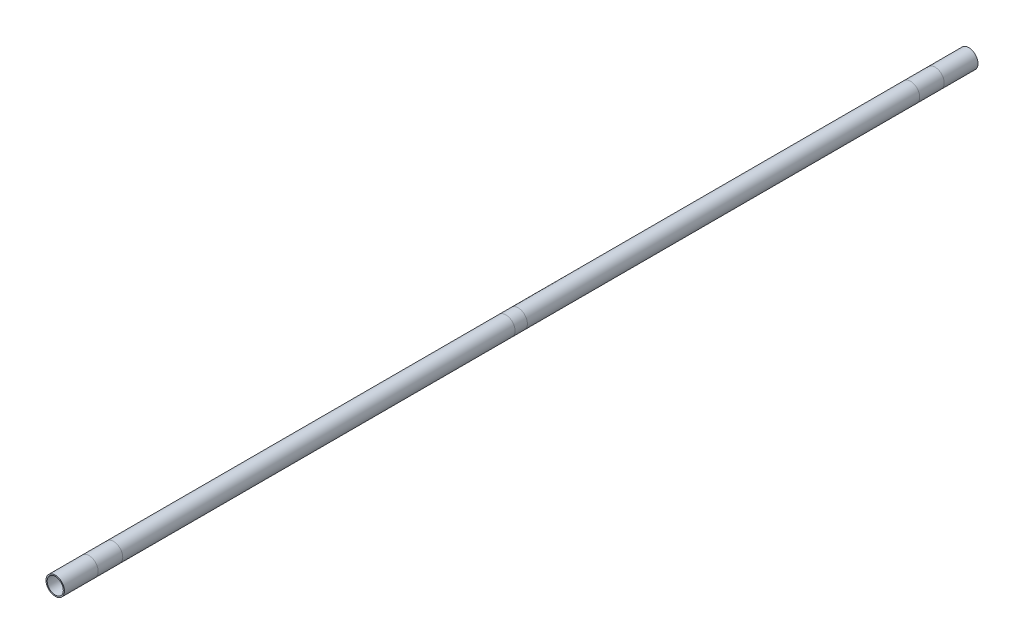
ISO-10303-21;
HEADER;
FILE_DESCRIPTION(('STEP AP214'),'2;1');
FILE_NAME('part.step','',(''),(''),'','','');
FILE_SCHEMA(('AUTOMOTIVE_DESIGN { 1 0 10303 214 1 1 1 1 }'));
ENDSEC;
DATA;
#1=APPLICATION_CONTEXT('core data for automotive mechanical design processes');
#2=APPLICATION_PROTOCOL_DEFINITION('international standard','automotive_design',2000,#1);
#3=PRODUCT_CONTEXT('',#1,'mechanical');
#4=PRODUCT('Part','Part','',(#3));
#5=PRODUCT_RELATED_PRODUCT_CATEGORY('part','',(#4));
#6=PRODUCT_DEFINITION_FORMATION('','',#4);
#7=PRODUCT_DEFINITION_CONTEXT('part definition',#1,'design');
#8=PRODUCT_DEFINITION('design','',#6,#7);
#9=PRODUCT_DEFINITION_SHAPE('','',#8);
#10=(LENGTH_UNIT() NAMED_UNIT(*) SI_UNIT(.MILLI.,.METRE.));
#11=(NAMED_UNIT(*) PLANE_ANGLE_UNIT() SI_UNIT($,.RADIAN.));
#12=(NAMED_UNIT(*) SI_UNIT($,.STERADIAN.) SOLID_ANGLE_UNIT());
#13=UNCERTAINTY_MEASURE_WITH_UNIT(LENGTH_MEASURE(1.E-05),#10,'distance_accuracy_value','');
#14=(GEOMETRIC_REPRESENTATION_CONTEXT(3) GLOBAL_UNCERTAINTY_ASSIGNED_CONTEXT((#13)) GLOBAL_UNIT_ASSIGNED_CONTEXT((#10,
#11,#12)) REPRESENTATION_CONTEXT('',''));
#15=CARTESIAN_POINT('',(0.,0.,0.));
#16=DIRECTION('',(0.,0.,1.));
#17=DIRECTION('',(1.,0.,0.));
#18=AXIS2_PLACEMENT_3D('',#15,#16,#17);
#19=CARTESIAN_POINT('',(0.,0.,2978.));
#20=DIRECTION('',(0.,0.,-1.));
#21=DIRECTION('',(-1.,0.,0.));
#22=AXIS2_PLACEMENT_3D('',#19,#20,#21);
#23=CYLINDRICAL_SURFACE('',#22,30.15);
#24=CARTESIAN_POINT('',(0.,0.,1469.));
#25=DIRECTION('',(0.,0.,1.));
#26=DIRECTION('',(1.,0.,0.));
#27=AXIS2_PLACEMENT_3D('',#24,#25,#26);
#28=CIRCLE('',#27,30.15);
#29=CARTESIAN_POINT('',(30.15,0.,1469.));
#30=VERTEX_POINT('',#29);
#31=EDGE_CURVE('E49',#30,#30,#28,.T.);
#32=ORIENTED_EDGE('',*,*,#31,.T.);
#33=EDGE_LOOP('',(#32));
#34=FACE_BOUND('',#33,.T.);
#35=CARTESIAN_POINT('',(0.,0.,1509.));
#36=DIRECTION('',(0.,0.,1.));
#37=DIRECTION('',(1.,0.,0.));
#38=AXIS2_PLACEMENT_3D('',#35,#36,#37);
#39=CIRCLE('',#38,30.15);
#40=CARTESIAN_POINT('',(30.15,0.,1509.));
#41=VERTEX_POINT('',#40);
#42=EDGE_CURVE('E10',#41,#41,#39,.T.);
#43=ORIENTED_EDGE('',*,*,#42,.F.);
#44=EDGE_LOOP('',(#43));
#45=FACE_BOUND('',#44,.T.);
#46=ADVANCED_FACE('F41',(#34,#45),#23,.T.);
#47=CARTESIAN_POINT('',(0.,0.,190.));
#48=DIRECTION('',(0.,0.,1.));
#49=DIRECTION('',(1.,0.,0.));
#50=AXIS2_PLACEMENT_3D('',#47,#48,#49);
#51=CIRCLE('',#50,30.15);
#52=CARTESIAN_POINT('',(30.15,0.,190.));
#53=VERTEX_POINT('',#52);
#54=EDGE_CURVE('E70',#53,#53,#51,.T.);
#55=ORIENTED_EDGE('',*,*,#54,.T.);
#56=EDGE_LOOP('',(#55));
#57=FACE_BOUND('',#56,.T.);
#58=ORIENTED_EDGE('',*,*,#31,.F.);
#59=EDGE_LOOP('',(#58));
#60=FACE_BOUND('',#59,.T.);
#61=ADVANCED_FACE('F108',(#57,#60),#23,.T.);
#62=CARTESIAN_POINT('',(0.,0.,2788.));
#63=DIRECTION('',(0.,0.,1.));
#64=DIRECTION('',(1.,0.,0.));
#65=AXIS2_PLACEMENT_3D('',#62,#63,#64);
#66=CIRCLE('',#65,30.15);
#67=CARTESIAN_POINT('',(30.15,0.,2788.));
#68=VERTEX_POINT('',#67);
#69=EDGE_CURVE('E65',#68,#68,#66,.T.);
#70=ORIENTED_EDGE('',*,*,#69,.T.);
#71=EDGE_LOOP('',(#70));
#72=FACE_BOUND('',#71,.T.);
#73=CARTESIAN_POINT('',(0.,0.,2868.));
#74=DIRECTION('',(0.,0.,1.));
#75=DIRECTION('',(1.,0.,0.));
#76=AXIS2_PLACEMENT_3D('',#73,#74,#75);
#77=CIRCLE('',#76,30.15);
#78=CARTESIAN_POINT('',(30.15,0.,2868.));
#79=VERTEX_POINT('',#78);
#80=EDGE_CURVE('E58',#79,#79,#77,.T.);
#81=ORIENTED_EDGE('',*,*,#80,.F.);
#82=EDGE_LOOP('',(#81));
#83=FACE_BOUND('',#82,.T.);
#84=ADVANCED_FACE('F112',(#72,#83),#23,.T.);
#85=ORIENTED_EDGE('',*,*,#42,.T.);
#86=EDGE_LOOP('',(#85));
#87=FACE_BOUND('',#86,.T.);
#88=ORIENTED_EDGE('',*,*,#69,.F.);
#89=EDGE_LOOP('',(#88));
#90=FACE_BOUND('',#89,.T.);
#91=ADVANCED_FACE('F125',(#87,#90),#23,.T.);
#92=CARTESIAN_POINT('',(0.,0.,110.));
#93=DIRECTION('',(0.,0.,1.));
#94=DIRECTION('',(1.,0.,0.));
#95=AXIS2_PLACEMENT_3D('',#92,#93,#94);
#96=CIRCLE('',#95,30.15);
#97=CARTESIAN_POINT('',(30.15,0.,110.));
#98=VERTEX_POINT('',#97);
#99=EDGE_CURVE('E73',#98,#98,#96,.T.);
#100=ORIENTED_EDGE('',*,*,#99,.T.);
#101=EDGE_LOOP('',(#100));
#102=FACE_BOUND('',#101,.T.);
#103=ORIENTED_EDGE('',*,*,#54,.F.);
#104=EDGE_LOOP('',(#103));
#105=FACE_BOUND('',#104,.T.);
#106=ADVANCED_FACE('F104',(#102,#105),#23,.T.);
#107=CARTESIAN_POINT('',(0.,0.,0.));
#108=DIRECTION('',(0.,0.,1.));
#109=DIRECTION('',(1.,0.,0.));
#110=AXIS2_PLACEMENT_3D('',#107,#108,#109);
#111=CIRCLE('',#110,30.15);
#112=CARTESIAN_POINT('',(30.15,0.,0.));
#113=VERTEX_POINT('',#112);
#114=EDGE_CURVE('E78',#113,#113,#111,.T.);
#115=ORIENTED_EDGE('',*,*,#114,.T.);
#116=EDGE_LOOP('',(#115));
#117=FACE_BOUND('',#116,.T.);
#118=ORIENTED_EDGE('',*,*,#99,.F.);
#119=EDGE_LOOP('',(#118));
#120=FACE_BOUND('',#119,.T.);
#121=ADVANCED_FACE('F96',(#117,#120),#23,.T.);
#122=CARTESIAN_POINT('',(0.,0.,2978.));
#123=DIRECTION('',(0.,0.,1.));
#124=DIRECTION('',(1.,0.,0.));
#125=AXIS2_PLACEMENT_3D('',#122,#123,#124);
#126=PLANE('',#125);
#127=CARTESIAN_POINT('',(0.,0.,2978.));
#128=DIRECTION('',(0.,0.,1.));
#129=DIRECTION('',(1.,0.,0.));
#130=AXIS2_PLACEMENT_3D('',#127,#128,#129);
#131=CIRCLE('',#130,30.15);
#132=CARTESIAN_POINT('',(30.15,0.,2978.));
#133=VERTEX_POINT('',#132);
#134=EDGE_CURVE('E77',#133,#133,#131,.T.);
#135=ORIENTED_EDGE('',*,*,#134,.T.);
#136=EDGE_LOOP('',(#135));
#137=FACE_BOUND('',#136,.T.);
#138=CARTESIAN_POINT('',(0.,0.,2978.));
#139=DIRECTION('',(0.,0.,1.));
#140=DIRECTION('',(1.,0.,0.));
#141=AXIS2_PLACEMENT_3D('',#138,#139,#140);
#142=CIRCLE('',#141,26.24);
#143=CARTESIAN_POINT('',(26.24,0.,2978.));
#144=VERTEX_POINT('',#143);
#145=EDGE_CURVE('E81',#144,#144,#142,.T.);
#146=ORIENTED_EDGE('',*,*,#145,.F.);
#147=EDGE_LOOP('',(#146));
#148=FACE_BOUND('',#147,.T.);
#149=ADVANCED_FACE('F93',(#137,#148),#126,.T.);
#150=CARTESIAN_POINT('',(0.,0.,0.));
#151=DIRECTION('',(0.,0.,1.));
#152=DIRECTION('',(1.,0.,0.));
#153=AXIS2_PLACEMENT_3D('',#150,#151,#152);
#154=PLANE('',#153);
#155=ORIENTED_EDGE('',*,*,#114,.F.);
#156=EDGE_LOOP('',(#155));
#157=FACE_BOUND('',#156,.T.);
#158=CARTESIAN_POINT('',(0.,0.,0.));
#159=DIRECTION('',(0.,0.,1.));
#160=DIRECTION('',(1.,0.,0.));
#161=AXIS2_PLACEMENT_3D('',#158,#159,#160);
#162=CIRCLE('',#161,26.24);
#163=CARTESIAN_POINT('',(26.24,0.,0.));
#164=VERTEX_POINT('',#163);
#165=EDGE_CURVE('E84',#164,#164,#162,.T.);
#166=ORIENTED_EDGE('',*,*,#165,.T.);
#167=EDGE_LOOP('',(#166));
#168=FACE_BOUND('',#167,.T.);
#169=ADVANCED_FACE('F95',(#157,#168),#154,.F.);
#170=ORIENTED_EDGE('',*,*,#80,.T.);
#171=EDGE_LOOP('',(#170));
#172=FACE_BOUND('',#171,.T.);
#173=ORIENTED_EDGE('',*,*,#134,.F.);
#174=EDGE_LOOP('',(#173));
#175=FACE_BOUND('',#174,.T.);
#176=ADVANCED_FACE('F43',(#172,#175),#23,.T.);
#177=CARTESIAN_POINT('',(0.,0.,2978.));
#178=DIRECTION('',(0.,0.,-1.));
#179=DIRECTION('',(-1.,0.,0.));
#180=AXIS2_PLACEMENT_3D('',#177,#178,#179);
#181=CYLINDRICAL_SURFACE('',#180,26.24);
#182=ORIENTED_EDGE('',*,*,#145,.T.);
#183=EDGE_LOOP('',(#182));
#184=FACE_BOUND('',#183,.T.);
#185=ORIENTED_EDGE('',*,*,#165,.F.);
#186=EDGE_LOOP('',(#185));
#187=FACE_BOUND('',#186,.T.);
#188=ADVANCED_FACE('F90',(#184,#187),#181,.F.);
#189=CLOSED_SHELL('',(#46,#61,#84,#91,#106,#121,#149,#169,#176,#188));
#190=MANIFOLD_SOLID_BREP('B2',#189);
#191=ADVANCED_BREP_SHAPE_REPRESENTATION('',(#18,#190),#14);
#192=SHAPE_DEFINITION_REPRESENTATION(#9,#191);
ENDSEC;
END-ISO-10303-21;
